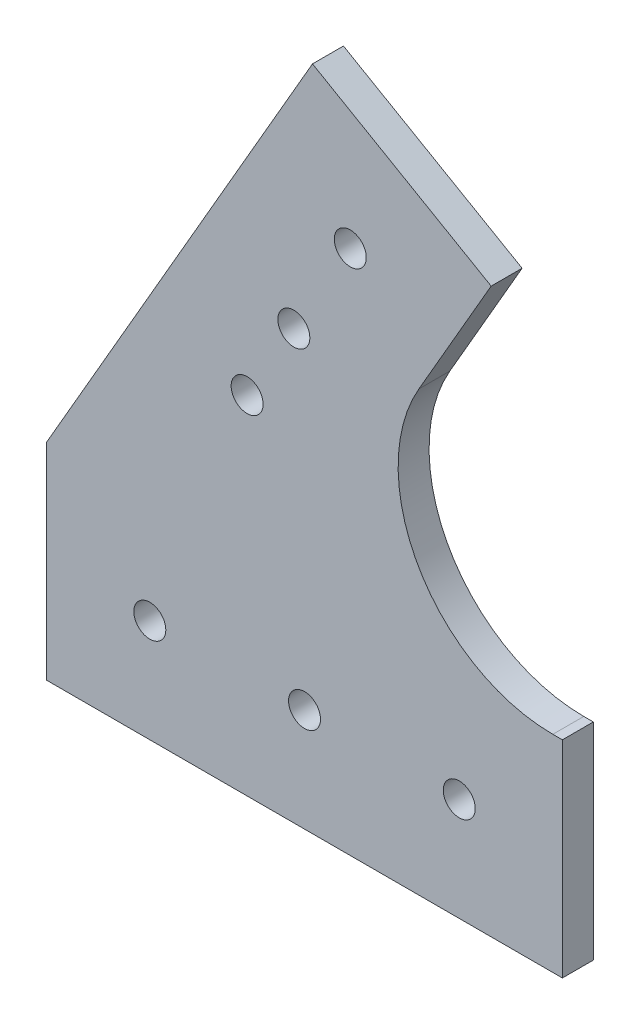
ISO-10303-21;
HEADER;
FILE_DESCRIPTION(('STEP AP214'),'2;1');
FILE_NAME('part.step','',(''),(''),'','','');
FILE_SCHEMA(('AUTOMOTIVE_DESIGN { 1 0 10303 214 1 1 1 1 }'));
ENDSEC;
DATA;
#1=APPLICATION_CONTEXT('core data for automotive mechanical design processes');
#2=APPLICATION_PROTOCOL_DEFINITION('international standard','automotive_design',2000,#1);
#3=PRODUCT_CONTEXT('',#1,'mechanical');
#4=PRODUCT('Part','Part','',(#3));
#5=PRODUCT_RELATED_PRODUCT_CATEGORY('part','',(#4));
#6=PRODUCT_DEFINITION_FORMATION('','',#4);
#7=PRODUCT_DEFINITION_CONTEXT('part definition',#1,'design');
#8=PRODUCT_DEFINITION('design','',#6,#7);
#9=PRODUCT_DEFINITION_SHAPE('','',#8);
#10=(LENGTH_UNIT() NAMED_UNIT(*) SI_UNIT(.MILLI.,.METRE.));
#11=(NAMED_UNIT(*) PLANE_ANGLE_UNIT() SI_UNIT($,.RADIAN.));
#12=(NAMED_UNIT(*) SI_UNIT($,.STERADIAN.) SOLID_ANGLE_UNIT());
#13=UNCERTAINTY_MEASURE_WITH_UNIT(LENGTH_MEASURE(1.E-05),#10,'distance_accuracy_value','');
#14=(GEOMETRIC_REPRESENTATION_CONTEXT(3) GLOBAL_UNCERTAINTY_ASSIGNED_CONTEXT((#13)) GLOBAL_UNIT_ASSIGNED_CONTEXT((#10,
#11,#12)) REPRESENTATION_CONTEXT('',''));
#15=CARTESIAN_POINT('',(0.,0.,0.));
#16=DIRECTION('',(0.,0.,1.));
#17=DIRECTION('',(1.,0.,0.));
#18=AXIS2_PLACEMENT_3D('',#15,#16,#17);
#19=CARTESIAN_POINT('',(-5.75961894323344,3.32531754730547,3.));
#20=DIRECTION('',(-0.86602540378444,0.499999999999998,0.));
#21=DIRECTION('',(-0.499999999999998,-0.86602540378444,0.));
#22=AXIS2_PLACEMENT_3D('',#19,#20,#21);
#23=PLANE('',#22);
#24=DIRECTION('',(0.499999999999998,0.86602540378444,0.));
#25=VECTOR('',#24,1.);
#26=CARTESIAN_POINT('',(-5.75961894323344,3.32531754730547,3.));
#27=LINE('',#26,#25);
#28=CARTESIAN_POINT('',(11.0843918243515,32.5,3.));
#29=VERTEX_POINT('',#28);
#30=CARTESIAN_POINT('',(18.0940107675849,44.6410161513776,3.));
#31=VERTEX_POINT('',#30);
#32=EDGE_CURVE('E110',#29,#31,#27,.T.);
#33=ORIENTED_EDGE('',*,*,#32,.F.);
#34=DIRECTION('',(0.,0.,-1.));
#35=VECTOR('',#34,1.);
#36=CARTESIAN_POINT('',(11.0843918243515,32.5,3.));
#37=LINE('',#36,#35);
#38=CARTESIAN_POINT('',(11.0843918243515,32.5,0.));
#39=VERTEX_POINT('',#38);
#40=EDGE_CURVE('E138',#29,#39,#37,.T.);
#41=ORIENTED_EDGE('',*,*,#40,.T.);
#42=DIRECTION('',(0.499999999999998,0.86602540378444,0.));
#43=VECTOR('',#42,1.);
#44=CARTESIAN_POINT('',(-5.75961894323344,3.32531754730547,0.));
#45=LINE('',#44,#43);
#46=CARTESIAN_POINT('',(18.0940107675849,44.6410161513776,0.));
#47=VERTEX_POINT('',#46);
#48=EDGE_CURVE('E135',#39,#47,#45,.T.);
#49=ORIENTED_EDGE('',*,*,#48,.T.);
#50=DIRECTION('',(0.,0.,-1.));
#51=VECTOR('',#50,1.);
#52=CARTESIAN_POINT('',(18.0940107675849,44.6410161513776,3.));
#53=LINE('',#52,#51);
#54=EDGE_CURVE('E129',#31,#47,#53,.T.);
#55=ORIENTED_EDGE('',*,*,#54,.F.);
#56=EDGE_LOOP('',(#33,#41,#49,#55));
#57=FACE_BOUND('',#56,.T.);
#58=ADVANCED_FACE('F47',(#57),#23,.F.);
#59=CARTESIAN_POINT('',(23.8536297108183,41.3156986040721,3.));
#60=DIRECTION('',(-0.499999999999997,-0.86602540378444,0.));
#61=DIRECTION('',(0.86602540378444,-0.499999999999998,0.));
#62=AXIS2_PLACEMENT_3D('',#59,#60,#61);
#63=PLANE('',#62);
#64=DIRECTION('',(-0.86602540378444,0.499999999999997,0.));
#65=VECTOR('',#64,1.);
#66=CARTESIAN_POINT('',(23.8536297108183,41.3156986040721,0.));
#67=LINE('',#66,#65);
#68=CARTESIAN_POINT('',(0.773502691896098,54.6410161513776,0.));
#69=VERTEX_POINT('',#68);
#70=EDGE_CURVE('E194',#47,#69,#67,.T.);
#71=ORIENTED_EDGE('',*,*,#70,.T.);
#72=DIRECTION('',(0.,0.,-1.));
#73=VECTOR('',#72,1.);
#74=CARTESIAN_POINT('',(0.773502691896098,54.6410161513776,3.));
#75=LINE('',#74,#73);
#76=CARTESIAN_POINT('',(0.773502691896098,54.6410161513776,3.));
#77=VERTEX_POINT('',#76);
#78=EDGE_CURVE('E130',#77,#69,#75,.T.);
#79=ORIENTED_EDGE('',*,*,#78,.F.);
#80=DIRECTION('',(-0.86602540378444,0.499999999999997,0.));
#81=VECTOR('',#80,1.);
#82=CARTESIAN_POINT('',(23.8536297108183,41.3156986040721,3.));
#83=LINE('',#82,#81);
#84=EDGE_CURVE('E115',#31,#77,#83,.T.);
#85=ORIENTED_EDGE('',*,*,#84,.F.);
#86=ORIENTED_EDGE('',*,*,#54,.T.);
#87=EDGE_LOOP('',(#71,#79,#85,#86));
#88=FACE_BOUND('',#87,.T.);
#89=ADVANCED_FACE('F128',(#88),#63,.F.);
#90=CARTESIAN_POINT('',(-23.0801270189222,13.3253175473054,3.));
#91=DIRECTION('',(-0.86602540378444,0.499999999999998,0.));
#92=DIRECTION('',(-0.499999999999998,-0.86602540378444,0.));
#93=AXIS2_PLACEMENT_3D('',#90,#91,#92);
#94=PLANE('',#93);
#95=DIRECTION('',(0.499999999999998,0.86602540378444,0.));
#96=VECTOR('',#95,1.);
#97=CARTESIAN_POINT('',(-23.0801270189222,13.3253175473054,0.));
#98=LINE('',#97,#96);
#99=CARTESIAN_POINT('',(-25.,10.,0.));
#100=VERTEX_POINT('',#99);
#101=EDGE_CURVE('E190',#100,#69,#98,.T.);
#102=ORIENTED_EDGE('',*,*,#101,.F.);
#103=DIRECTION('',(0.,0.,-1.));
#104=VECTOR('',#103,1.);
#105=CARTESIAN_POINT('',(-25.,10.,3.));
#106=LINE('',#105,#104);
#107=CARTESIAN_POINT('',(-25.,10.,3.));
#108=VERTEX_POINT('',#107);
#109=EDGE_CURVE('E143',#108,#100,#106,.T.);
#110=ORIENTED_EDGE('',*,*,#109,.F.);
#111=DIRECTION('',(0.499999999999998,0.86602540378444,0.));
#112=VECTOR('',#111,1.);
#113=CARTESIAN_POINT('',(-23.0801270189222,13.3253175473054,3.));
#114=LINE('',#113,#112);
#115=EDGE_CURVE('E133',#108,#77,#114,.T.);
#116=ORIENTED_EDGE('',*,*,#115,.T.);
#117=ORIENTED_EDGE('',*,*,#78,.T.);
#118=EDGE_LOOP('',(#102,#110,#116,#117));
#119=FACE_BOUND('',#118,.T.);
#120=ADVANCED_FACE('F292',(#119),#94,.T.);
#121=CARTESIAN_POINT('',(-25.,0.,3.));
#122=DIRECTION('',(1.,0.,0.));
#123=DIRECTION('',(0.,1.,0.));
#124=AXIS2_PLACEMENT_3D('',#121,#122,#123);
#125=PLANE('',#124);
#126=DIRECTION('',(0.,-1.,0.));
#127=VECTOR('',#126,1.);
#128=CARTESIAN_POINT('',(-25.,0.,0.));
#129=LINE('',#128,#127);
#130=CARTESIAN_POINT('',(-25.,-10.,0.));
#131=VERTEX_POINT('',#130);
#132=EDGE_CURVE('E187',#100,#131,#129,.T.);
#133=ORIENTED_EDGE('',*,*,#132,.T.);
#134=DIRECTION('',(0.,0.,-1.));
#135=VECTOR('',#134,1.);
#136=CARTESIAN_POINT('',(-25.,-10.,3.));
#137=LINE('',#136,#135);
#138=CARTESIAN_POINT('',(-25.,-10.,3.));
#139=VERTEX_POINT('',#138);
#140=EDGE_CURVE('E151',#139,#131,#137,.T.);
#141=ORIENTED_EDGE('',*,*,#140,.F.);
#142=DIRECTION('',(0.,-1.,0.));
#143=VECTOR('',#142,1.);
#144=CARTESIAN_POINT('',(-25.,0.,3.));
#145=LINE('',#144,#143);
#146=EDGE_CURVE('E232',#108,#139,#145,.T.);
#147=ORIENTED_EDGE('',*,*,#146,.F.);
#148=ORIENTED_EDGE('',*,*,#109,.T.);
#149=EDGE_LOOP('',(#133,#141,#147,#148));
#150=FACE_BOUND('',#149,.T.);
#151=ADVANCED_FACE('F392',(#150),#125,.F.);
#152=CARTESIAN_POINT('',(0.,-10.,3.));
#153=DIRECTION('',(0.,1.,0.));
#154=DIRECTION('',(-1.,0.,0.));
#155=AXIS2_PLACEMENT_3D('',#152,#153,#154);
#156=PLANE('',#155);
#157=DIRECTION('',(1.,0.,0.));
#158=VECTOR('',#157,1.);
#159=CARTESIAN_POINT('',(0.,-10.,0.));
#160=LINE('',#159,#158);
#161=CARTESIAN_POINT('',(25.,-10.,0.));
#162=VERTEX_POINT('',#161);
#163=EDGE_CURVE('E183',#131,#162,#160,.T.);
#164=ORIENTED_EDGE('',*,*,#163,.T.);
#165=DIRECTION('',(0.,0.,-1.));
#166=VECTOR('',#165,1.);
#167=CARTESIAN_POINT('',(25.,-10.,3.));
#168=LINE('',#167,#166);
#169=CARTESIAN_POINT('',(25.,-10.,3.));
#170=VERTEX_POINT('',#169);
#171=EDGE_CURVE('E155',#170,#162,#168,.T.);
#172=ORIENTED_EDGE('',*,*,#171,.F.);
#173=DIRECTION('',(1.,0.,0.));
#174=VECTOR('',#173,1.);
#175=CARTESIAN_POINT('',(0.,-10.,3.));
#176=LINE('',#175,#174);
#177=EDGE_CURVE('E229',#139,#170,#176,.T.);
#178=ORIENTED_EDGE('',*,*,#177,.F.);
#179=ORIENTED_EDGE('',*,*,#140,.T.);
#180=EDGE_LOOP('',(#164,#172,#178,#179));
#181=FACE_BOUND('',#180,.T.);
#182=ADVANCED_FACE('F382',(#181),#156,.F.);
#183=CARTESIAN_POINT('',(25.,0.,3.));
#184=DIRECTION('',(1.,0.,0.));
#185=DIRECTION('',(0.,0.,-1.));
#186=AXIS2_PLACEMENT_3D('',#183,#184,#185);
#187=PLANE('',#186);
#188=DIRECTION('',(0.,-1.,0.));
#189=VECTOR('',#188,1.);
#190=CARTESIAN_POINT('',(25.,0.,0.));
#191=LINE('',#190,#189);
#192=CARTESIAN_POINT('',(25.,10.,0.));
#193=VERTEX_POINT('',#192);
#194=EDGE_CURVE('E179',#193,#162,#191,.T.);
#195=ORIENTED_EDGE('',*,*,#194,.F.);
#196=DIRECTION('',(0.,0.,-1.));
#197=VECTOR('',#196,1.);
#198=CARTESIAN_POINT('',(25.,10.,3.));
#199=LINE('',#198,#197);
#200=CARTESIAN_POINT('',(25.,10.,3.));
#201=VERTEX_POINT('',#200);
#202=EDGE_CURVE('E158',#201,#193,#199,.T.);
#203=ORIENTED_EDGE('',*,*,#202,.F.);
#204=DIRECTION('',(0.,-1.,0.));
#205=VECTOR('',#204,1.);
#206=CARTESIAN_POINT('',(25.,0.,3.));
#207=LINE('',#206,#205);
#208=EDGE_CURVE('E225',#201,#170,#207,.T.);
#209=ORIENTED_EDGE('',*,*,#208,.T.);
#210=ORIENTED_EDGE('',*,*,#171,.T.);
#211=EDGE_LOOP('',(#195,#203,#209,#210));
#212=FACE_BOUND('',#211,.T.);
#213=ADVANCED_FACE('F373',(#212),#187,.T.);
#214=CARTESIAN_POINT('',(15.,0.,3.));
#215=DIRECTION('',(0.,0.,-1.));
#216=DIRECTION('',(-1.,0.,0.));
#217=AXIS2_PLACEMENT_3D('',#214,#215,#216);
#218=CYLINDRICAL_SURFACE('',#217,1.55);
#219=CARTESIAN_POINT('',(15.,0.,3.));
#220=DIRECTION('',(0.,0.,1.));
#221=DIRECTION('',(1.,0.,0.));
#222=AXIS2_PLACEMENT_3D('',#219,#220,#221);
#223=CIRCLE('',#222,1.55);
#224=CARTESIAN_POINT('',(16.55,0.,3.));
#225=VERTEX_POINT('',#224);
#226=EDGE_CURVE('E214',#225,#225,#223,.T.);
#227=ORIENTED_EDGE('',*,*,#226,.T.);
#228=EDGE_LOOP('',(#227));
#229=FACE_BOUND('',#228,.T.);
#230=CARTESIAN_POINT('',(15.,0.,0.));
#231=DIRECTION('',(0.,0.,1.));
#232=DIRECTION('',(1.,0.,0.));
#233=AXIS2_PLACEMENT_3D('',#230,#231,#232);
#234=CIRCLE('',#233,1.55);
#235=CARTESIAN_POINT('',(16.55,0.,0.));
#236=VERTEX_POINT('',#235);
#237=EDGE_CURVE('E168',#236,#236,#234,.T.);
#238=ORIENTED_EDGE('',*,*,#237,.F.);
#239=EDGE_LOOP('',(#238));
#240=FACE_BOUND('',#239,.T.);
#241=ADVANCED_FACE('F363',(#229,#240),#218,.F.);
#242=CARTESIAN_POINT('',(0.,0.,3.));
#243=DIRECTION('',(0.,0.,-1.));
#244=DIRECTION('',(-1.,0.,0.));
#245=AXIS2_PLACEMENT_3D('',#242,#243,#244);
#246=CYLINDRICAL_SURFACE('',#245,1.55);
#247=CARTESIAN_POINT('',(0.,0.,3.));
#248=DIRECTION('',(0.,0.,1.));
#249=DIRECTION('',(1.,0.,0.));
#250=AXIS2_PLACEMENT_3D('',#247,#248,#249);
#251=CIRCLE('',#250,1.55);
#252=CARTESIAN_POINT('',(1.55000000000001,0.,3.));
#253=VERTEX_POINT('',#252);
#254=EDGE_CURVE('E218',#253,#253,#251,.T.);
#255=ORIENTED_EDGE('',*,*,#254,.T.);
#256=EDGE_LOOP('',(#255));
#257=FACE_BOUND('',#256,.T.);
#258=CARTESIAN_POINT('',(0.,0.,0.));
#259=DIRECTION('',(0.,0.,1.));
#260=DIRECTION('',(1.,0.,0.));
#261=AXIS2_PLACEMENT_3D('',#258,#259,#260);
#262=CIRCLE('',#261,1.55);
#263=CARTESIAN_POINT('',(1.55000000000001,0.,0.));
#264=VERTEX_POINT('',#263);
#265=EDGE_CURVE('E172',#264,#264,#262,.T.);
#266=ORIENTED_EDGE('',*,*,#265,.F.);
#267=EDGE_LOOP('',(#266));
#268=FACE_BOUND('',#267,.T.);
#269=ADVANCED_FACE('F347',(#257,#268),#246,.F.);
#270=CARTESIAN_POINT('',(0.,10.,3.));
#271=DIRECTION('',(0.,1.,0.));
#272=DIRECTION('',(0.,0.,1.));
#273=AXIS2_PLACEMENT_3D('',#270,#271,#272);
#274=PLANE('',#273);
#275=DIRECTION('',(1.,0.,0.));
#276=VECTOR('',#275,1.);
#277=CARTESIAN_POINT('',(0.,10.,0.));
#278=LINE('',#277,#276);
#279=CARTESIAN_POINT('',(24.0747728811181,10.,0.));
#280=VERTEX_POINT('',#279);
#281=EDGE_CURVE('E176',#280,#193,#278,.T.);
#282=ORIENTED_EDGE('',*,*,#281,.F.);
#283=DIRECTION('',(0.,0.,-1.));
#284=VECTOR('',#283,1.);
#285=CARTESIAN_POINT('',(24.0747728811181,10.,3.));
#286=LINE('',#285,#284);
#287=CARTESIAN_POINT('',(24.0747728811181,10.,3.));
#288=VERTEX_POINT('',#287);
#289=EDGE_CURVE('E63',#280,#288,#286,.F.);
#290=ORIENTED_EDGE('',*,*,#289,.T.);
#291=DIRECTION('',(1.,0.,0.));
#292=VECTOR('',#291,1.);
#293=CARTESIAN_POINT('',(0.,10.,3.));
#294=LINE('',#293,#292);
#295=EDGE_CURVE('E222',#288,#201,#294,.T.);
#296=ORIENTED_EDGE('',*,*,#295,.T.);
#297=ORIENTED_EDGE('',*,*,#202,.T.);
#298=EDGE_LOOP('',(#282,#290,#296,#297));
#299=FACE_BOUND('',#298,.T.);
#300=ADVANCED_FACE('F264',(#299),#274,.T.);
#301=CARTESIAN_POINT('',(-5.56624327025941,23.6602540378444,3.));
#302=DIRECTION('',(0.,0.,-1.));
#303=DIRECTION('',(-1.,0.,0.));
#304=AXIS2_PLACEMENT_3D('',#301,#302,#303);
#305=CYLINDRICAL_SURFACE('',#304,1.55);
#306=CARTESIAN_POINT('',(-5.56624327025941,23.6602540378444,3.));
#307=DIRECTION('',(0.,0.,1.));
#308=DIRECTION('',(1.,0.,0.));
#309=AXIS2_PLACEMENT_3D('',#306,#307,#308);
#310=CIRCLE('',#309,1.55);
#311=CARTESIAN_POINT('',(-4.01624327025941,23.6602540378444,3.));
#312=VERTEX_POINT('',#311);
#313=EDGE_CURVE('E123',#312,#312,#310,.T.);
#314=ORIENTED_EDGE('',*,*,#313,.T.);
#315=EDGE_LOOP('',(#314));
#316=FACE_BOUND('',#315,.T.);
#317=CARTESIAN_POINT('',(-5.56624327025941,23.6602540378444,0.));
#318=DIRECTION('',(0.,0.,1.));
#319=DIRECTION('',(1.,0.,0.));
#320=AXIS2_PLACEMENT_3D('',#317,#318,#319);
#321=CIRCLE('',#320,1.55);
#322=CARTESIAN_POINT('',(-4.01624327025941,23.6602540378444,0.));
#323=VERTEX_POINT('',#322);
#324=EDGE_CURVE('E199',#323,#323,#321,.T.);
#325=ORIENTED_EDGE('',*,*,#324,.F.);
#326=EDGE_LOOP('',(#325));
#327=FACE_BOUND('',#326,.T.);
#328=ADVANCED_FACE('F260',(#316,#327),#305,.F.);
#329=CARTESIAN_POINT('',(4.43375672974053,40.9807621135332,3.));
#330=DIRECTION('',(0.,0.,-1.));
#331=DIRECTION('',(-1.,0.,0.));
#332=AXIS2_PLACEMENT_3D('',#329,#330,#331);
#333=CYLINDRICAL_SURFACE('',#332,1.55);
#334=CARTESIAN_POINT('',(4.43375672974053,40.9807621135332,3.));
#335=DIRECTION('',(0.,0.,1.));
#336=DIRECTION('',(1.,0.,0.));
#337=AXIS2_PLACEMENT_3D('',#334,#335,#336);
#338=CIRCLE('',#337,1.55);
#339=CARTESIAN_POINT('',(5.98375672974053,40.9807621135332,3.));
#340=VERTEX_POINT('',#339);
#341=EDGE_CURVE('E240',#340,#340,#338,.T.);
#342=ORIENTED_EDGE('',*,*,#341,.T.);
#343=EDGE_LOOP('',(#342));
#344=FACE_BOUND('',#343,.T.);
#345=CARTESIAN_POINT('',(4.43375672974053,40.9807621135332,0.));
#346=DIRECTION('',(0.,0.,1.));
#347=DIRECTION('',(1.,0.,0.));
#348=AXIS2_PLACEMENT_3D('',#345,#346,#347);
#349=CIRCLE('',#348,1.55);
#350=CARTESIAN_POINT('',(5.98375672974053,40.9807621135332,0.));
#351=VERTEX_POINT('',#350);
#352=EDGE_CURVE('E203',#351,#351,#349,.T.);
#353=ORIENTED_EDGE('',*,*,#352,.F.);
#354=EDGE_LOOP('',(#353));
#355=FACE_BOUND('',#354,.T.);
#356=ADVANCED_FACE('F263',(#344,#355),#333,.F.);
#357=CARTESIAN_POINT('',(-1.03587553883637,31.5070811256397,3.));
#358=DIRECTION('',(0.,0.,-1.));
#359=DIRECTION('',(-1.,0.,0.));
#360=AXIS2_PLACEMENT_3D('',#357,#358,#359);
#361=CYLINDRICAL_SURFACE('',#360,1.55);
#362=CARTESIAN_POINT('',(-1.03587553883637,31.5070811256397,3.));
#363=DIRECTION('',(0.,0.,1.));
#364=DIRECTION('',(1.,0.,0.));
#365=AXIS2_PLACEMENT_3D('',#362,#363,#364);
#366=CIRCLE('',#365,1.55);
#367=CARTESIAN_POINT('',(0.514124461163629,31.5070811256397,3.));
#368=VERTEX_POINT('',#367);
#369=EDGE_CURVE('E167',#368,#368,#366,.T.);
#370=ORIENTED_EDGE('',*,*,#369,.T.);
#371=EDGE_LOOP('',(#370));
#372=FACE_BOUND('',#371,.T.);
#373=CARTESIAN_POINT('',(-1.03587553883637,31.5070811256397,0.));
#374=DIRECTION('',(0.,0.,1.));
#375=DIRECTION('',(1.,0.,0.));
#376=AXIS2_PLACEMENT_3D('',#373,#374,#375);
#377=CIRCLE('',#376,1.55);
#378=CARTESIAN_POINT('',(0.514124461163629,31.5070811256397,0.));
#379=VERTEX_POINT('',#378);
#380=EDGE_CURVE('E207',#379,#379,#377,.T.);
#381=ORIENTED_EDGE('',*,*,#380,.F.);
#382=EDGE_LOOP('',(#381));
#383=FACE_BOUND('',#382,.T.);
#384=ADVANCED_FACE('F248',(#372,#383),#361,.F.);
#385=CARTESIAN_POINT('',(-15.,0.,3.));
#386=DIRECTION('',(0.,0.,-1.));
#387=DIRECTION('',(-1.,0.,0.));
#388=AXIS2_PLACEMENT_3D('',#385,#386,#387);
#389=CYLINDRICAL_SURFACE('',#388,1.55);
#390=CARTESIAN_POINT('',(-15.,0.,3.));
#391=DIRECTION('',(0.,0.,1.));
#392=DIRECTION('',(1.,0.,0.));
#393=AXIS2_PLACEMENT_3D('',#390,#391,#392);
#394=CIRCLE('',#393,1.55);
#395=CARTESIAN_POINT('',(-13.45,0.,3.));
#396=VERTEX_POINT('',#395);
#397=EDGE_CURVE('E162',#396,#396,#394,.F.);
#398=ORIENTED_EDGE('',*,*,#397,.F.);
#399=EDGE_LOOP('',(#398));
#400=FACE_BOUND('',#399,.T.);
#401=CARTESIAN_POINT('',(-15.,0.,0.));
#402=DIRECTION('',(0.,0.,1.));
#403=DIRECTION('',(1.,0.,0.));
#404=AXIS2_PLACEMENT_3D('',#401,#402,#403);
#405=CIRCLE('',#404,1.55);
#406=CARTESIAN_POINT('',(-13.45,0.,0.));
#407=VERTEX_POINT('',#406);
#408=EDGE_CURVE('E163',#407,#407,#405,.F.);
#409=ORIENTED_EDGE('',*,*,#408,.T.);
#410=EDGE_LOOP('',(#409));
#411=FACE_BOUND('',#410,.T.);
#412=ADVANCED_FACE('F254',(#400,#411),#389,.F.);
#413=CARTESIAN_POINT('',(0.,0.,3.));
#414=DIRECTION('',(0.,0.,1.));
#415=DIRECTION('',(1.,0.,0.));
#416=AXIS2_PLACEMENT_3D('',#413,#414,#415);
#417=PLANE('',#416);
#418=ORIENTED_EDGE('',*,*,#369,.F.);
#419=EDGE_LOOP('',(#418));
#420=FACE_BOUND('',#419,.T.);
#421=ORIENTED_EDGE('',*,*,#341,.F.);
#422=EDGE_LOOP('',(#421));
#423=FACE_BOUND('',#422,.T.);
#424=ORIENTED_EDGE('',*,*,#313,.F.);
#425=EDGE_LOOP('',(#424));
#426=FACE_BOUND('',#425,.T.);
#427=ORIENTED_EDGE('',*,*,#295,.F.);
#428=CARTESIAN_POINT('',(24.0747728811181,25.,3.));
#429=DIRECTION('',(0.,0.,1.));
#430=DIRECTION('',(1.,0.,0.));
#431=AXIS2_PLACEMENT_3D('',#428,#429,#430);
#432=CIRCLE('',#431,15.);
#433=EDGE_CURVE('E11',#288,#29,#432,.F.);
#434=ORIENTED_EDGE('',*,*,#433,.T.);
#435=ORIENTED_EDGE('',*,*,#32,.T.);
#436=ORIENTED_EDGE('',*,*,#84,.T.);
#437=ORIENTED_EDGE('',*,*,#115,.F.);
#438=ORIENTED_EDGE('',*,*,#146,.T.);
#439=ORIENTED_EDGE('',*,*,#177,.T.);
#440=ORIENTED_EDGE('',*,*,#208,.F.);
#441=EDGE_LOOP('',(#427,#434,#435,#436,#437,#438,#439,#440));
#442=FACE_BOUND('',#441,.T.);
#443=ORIENTED_EDGE('',*,*,#254,.F.);
#444=EDGE_LOOP('',(#443));
#445=FACE_BOUND('',#444,.T.);
#446=ORIENTED_EDGE('',*,*,#226,.F.);
#447=EDGE_LOOP('',(#446));
#448=FACE_BOUND('',#447,.T.);
#449=ORIENTED_EDGE('',*,*,#397,.T.);
#450=EDGE_LOOP('',(#449));
#451=FACE_BOUND('',#450,.T.);
#452=ADVANCED_FACE('F112',(#420,#423,#426,#442,#445,#448,#451),#417,.T.);
#453=CARTESIAN_POINT('',(0.,0.,0.));
#454=DIRECTION('',(0.,0.,1.));
#455=DIRECTION('',(1.,0.,0.));
#456=AXIS2_PLACEMENT_3D('',#453,#454,#455);
#457=PLANE('',#456);
#458=ORIENTED_EDGE('',*,*,#380,.T.);
#459=EDGE_LOOP('',(#458));
#460=FACE_BOUND('',#459,.T.);
#461=ORIENTED_EDGE('',*,*,#352,.T.);
#462=EDGE_LOOP('',(#461));
#463=FACE_BOUND('',#462,.T.);
#464=ORIENTED_EDGE('',*,*,#324,.T.);
#465=EDGE_LOOP('',(#464));
#466=FACE_BOUND('',#465,.T.);
#467=ORIENTED_EDGE('',*,*,#48,.F.);
#468=CARTESIAN_POINT('',(24.0747728811181,25.,0.));
#469=DIRECTION('',(0.,0.,1.));
#470=DIRECTION('',(1.,0.,0.));
#471=AXIS2_PLACEMENT_3D('',#468,#469,#470);
#472=CIRCLE('',#471,15.);
#473=EDGE_CURVE('E56',#39,#280,#472,.T.);
#474=ORIENTED_EDGE('',*,*,#473,.T.);
#475=ORIENTED_EDGE('',*,*,#281,.T.);
#476=ORIENTED_EDGE('',*,*,#194,.T.);
#477=ORIENTED_EDGE('',*,*,#163,.F.);
#478=ORIENTED_EDGE('',*,*,#132,.F.);
#479=ORIENTED_EDGE('',*,*,#101,.T.);
#480=ORIENTED_EDGE('',*,*,#70,.F.);
#481=EDGE_LOOP('',(#467,#474,#475,#476,#477,#478,#479,#480));
#482=FACE_BOUND('',#481,.T.);
#483=ORIENTED_EDGE('',*,*,#265,.T.);
#484=EDGE_LOOP('',(#483));
#485=FACE_BOUND('',#484,.T.);
#486=ORIENTED_EDGE('',*,*,#237,.T.);
#487=EDGE_LOOP('',(#486));
#488=FACE_BOUND('',#487,.T.);
#489=ORIENTED_EDGE('',*,*,#408,.F.);
#490=EDGE_LOOP('',(#489));
#491=FACE_BOUND('',#490,.T.);
#492=ADVANCED_FACE('F253',(#460,#463,#466,#482,#485,#488,#491),#457,.F.);
#493=CARTESIAN_POINT('',(24.0747728811181,25.,3.));
#494=DIRECTION('',(0.,0.,-1.));
#495=DIRECTION('',(-1.,0.,0.));
#496=AXIS2_PLACEMENT_3D('',#493,#494,#495);
#497=CYLINDRICAL_SURFACE('',#496,15.);
#498=ORIENTED_EDGE('',*,*,#433,.F.);
#499=ORIENTED_EDGE('',*,*,#289,.F.);
#500=ORIENTED_EDGE('',*,*,#473,.F.);
#501=ORIENTED_EDGE('',*,*,#40,.F.);
#502=EDGE_LOOP('',(#498,#499,#500,#501));
#503=FACE_BOUND('',#502,.T.);
#504=ADVANCED_FACE('F49',(#503),#497,.F.);
#505=CLOSED_SHELL('',(#58,#89,#120,#151,#182,#213,#241,#269,#300,#328,#356,#384,#412,#452,#492,#504));
#506=MANIFOLD_SOLID_BREP('B2',#505);
#507=ADVANCED_BREP_SHAPE_REPRESENTATION('',(#18,#506),#14);
#508=SHAPE_DEFINITION_REPRESENTATION(#9,#507);
ENDSEC;
END-ISO-10303-21;
